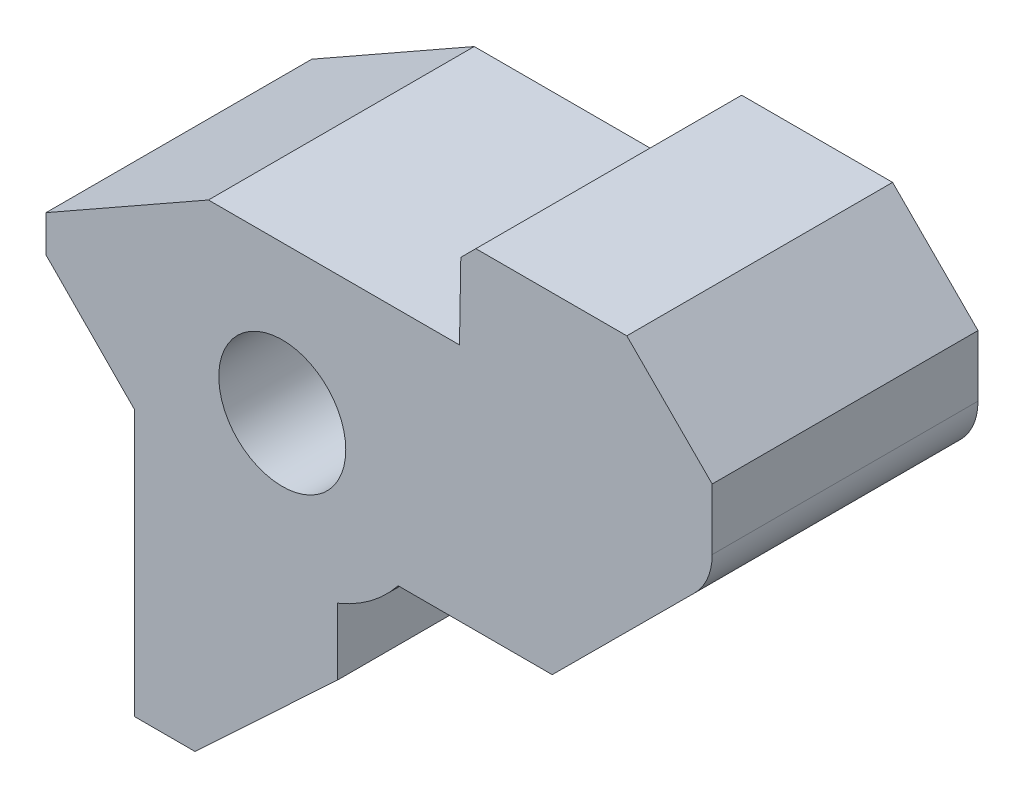
ISO-10303-21;
HEADER;
FILE_DESCRIPTION(('STEP AP214'),'2;1');
FILE_NAME('part.step','',(''),(''),'','','');
FILE_SCHEMA(('AUTOMOTIVE_DESIGN { 1 0 10303 214 1 1 1 1 }'));
ENDSEC;
DATA;
#1=APPLICATION_CONTEXT('core data for automotive mechanical design processes');
#2=APPLICATION_PROTOCOL_DEFINITION('international standard','automotive_design',2000,#1);
#3=PRODUCT_CONTEXT('',#1,'mechanical');
#4=PRODUCT('Part','Part','',(#3));
#5=PRODUCT_RELATED_PRODUCT_CATEGORY('part','',(#4));
#6=PRODUCT_DEFINITION_FORMATION('','',#4);
#7=PRODUCT_DEFINITION_CONTEXT('part definition',#1,'design');
#8=PRODUCT_DEFINITION('design','',#6,#7);
#9=PRODUCT_DEFINITION_SHAPE('','',#8);
#10=(LENGTH_UNIT() NAMED_UNIT(*) SI_UNIT(.MILLI.,.METRE.));
#11=(NAMED_UNIT(*) PLANE_ANGLE_UNIT() SI_UNIT($,.RADIAN.));
#12=(NAMED_UNIT(*) SI_UNIT($,.STERADIAN.) SOLID_ANGLE_UNIT());
#13=UNCERTAINTY_MEASURE_WITH_UNIT(LENGTH_MEASURE(1.E-05),#10,'distance_accuracy_value','');
#14=(GEOMETRIC_REPRESENTATION_CONTEXT(3) GLOBAL_UNCERTAINTY_ASSIGNED_CONTEXT((#13)) GLOBAL_UNIT_ASSIGNED_CONTEXT((#10,
#11,#12)) REPRESENTATION_CONTEXT('',''));
#15=CARTESIAN_POINT('',(0.,0.,0.));
#16=DIRECTION('',(0.,0.,1.));
#17=DIRECTION('',(1.,0.,0.));
#18=AXIS2_PLACEMENT_3D('',#15,#16,#17);
#19=CARTESIAN_POINT('',(0.,5.,4.5));
#20=DIRECTION('',(0.,-1.,0.));
#21=DIRECTION('',(1.,0.,0.));
#22=AXIS2_PLACEMENT_3D('',#19,#20,#21);
#23=PLANE('',#22);
#24=DIRECTION('',(-1.,0.,0.));
#25=VECTOR('',#24,1.);
#26=CARTESIAN_POINT('',(0.,5.,-4.5));
#27=LINE('',#26,#25);
#28=CARTESIAN_POINT('',(6.,5.,-4.5));
#29=VERTEX_POINT('',#28);
#30=CARTESIAN_POINT('',(-2.5,5.,-4.5));
#31=VERTEX_POINT('',#30);
#32=EDGE_CURVE('E169',#29,#31,#27,.T.);
#33=ORIENTED_EDGE('',*,*,#32,.T.);
#34=DIRECTION('',(0.,0.,-1.));
#35=VECTOR('',#34,1.);
#36=CARTESIAN_POINT('',(-2.5,5.,4.5));
#37=LINE('',#36,#35);
#38=CARTESIAN_POINT('',(-2.5,5.,4.5));
#39=VERTEX_POINT('',#38);
#40=EDGE_CURVE('E167',#39,#31,#37,.T.);
#41=ORIENTED_EDGE('',*,*,#40,.F.);
#42=DIRECTION('',(-1.,0.,0.));
#43=VECTOR('',#42,1.);
#44=CARTESIAN_POINT('',(0.,5.,4.5));
#45=LINE('',#44,#43);
#46=CARTESIAN_POINT('',(6.,5.,4.5));
#47=VERTEX_POINT('',#46);
#48=EDGE_CURVE('E153',#47,#39,#45,.T.);
#49=ORIENTED_EDGE('',*,*,#48,.F.);
#50=DIRECTION('',(0.,0.,-1.));
#51=VECTOR('',#50,1.);
#52=CARTESIAN_POINT('',(6.,5.,4.5));
#53=LINE('',#52,#51);
#54=EDGE_CURVE('E214',#47,#29,#53,.T.);
#55=ORIENTED_EDGE('',*,*,#54,.T.);
#56=EDGE_LOOP('',(#33,#41,#49,#55));
#57=FACE_BOUND('',#56,.T.);
#58=ADVANCED_FACE('F35',(#57),#23,.F.);
#59=CARTESIAN_POINT('',(-2.75518541810542,4.85518934634199,4.5));
#60=DIRECTION('',(-0.49354284315925,0.869721485284964,0.));
#61=DIRECTION('',(-0.869721485284964,-0.49354284315925,0.));
#62=AXIS2_PLACEMENT_3D('',#59,#60,#61);
#63=PLANE('',#62);
#64=DIRECTION('',(0.869721485284964,0.49354284315925,0.));
#65=VECTOR('',#64,1.);
#66=CARTESIAN_POINT('',(-2.75518541810542,4.85518934634199,-4.5));
#67=LINE('',#66,#65);
#68=CARTESIAN_POINT('',(-8.,1.87890240346716,-4.5));
#69=VERTEX_POINT('',#68);
#70=EDGE_CURVE('E216',#69,#31,#67,.T.);
#71=ORIENTED_EDGE('',*,*,#70,.F.);
#72=DIRECTION('',(0.,0.,-1.));
#73=VECTOR('',#72,1.);
#74=CARTESIAN_POINT('',(-8.,1.87890240346716,4.5));
#75=LINE('',#74,#73);
#76=CARTESIAN_POINT('',(-8.,1.87890240346716,4.5));
#77=VERTEX_POINT('',#76);
#78=EDGE_CURVE('E174',#77,#69,#75,.T.);
#79=ORIENTED_EDGE('',*,*,#78,.F.);
#80=DIRECTION('',(0.869721485284964,0.49354284315925,0.));
#81=VECTOR('',#80,1.);
#82=CARTESIAN_POINT('',(-2.75518541810542,4.85518934634199,4.5));
#83=LINE('',#82,#81);
#84=EDGE_CURVE('E159',#77,#39,#83,.T.);
#85=ORIENTED_EDGE('',*,*,#84,.T.);
#86=ORIENTED_EDGE('',*,*,#40,.T.);
#87=EDGE_LOOP('',(#71,#79,#85,#86));
#88=FACE_BOUND('',#87,.T.);
#89=ADVANCED_FACE('F176',(#88),#63,.T.);
#90=CARTESIAN_POINT('',(-8.,0.,4.5));
#91=DIRECTION('',(-1.,0.,0.));
#92=DIRECTION('',(0.,0.,1.));
#93=AXIS2_PLACEMENT_3D('',#90,#91,#92);
#94=PLANE('',#93);
#95=DIRECTION('',(0.,1.,0.));
#96=VECTOR('',#95,1.);
#97=CARTESIAN_POINT('',(-8.,0.,-4.5));
#98=LINE('',#97,#96);
#99=CARTESIAN_POINT('',(-8.,0.63825131466549,-4.5));
#100=VERTEX_POINT('',#99);
#101=EDGE_CURVE('E218',#100,#69,#98,.T.);
#102=ORIENTED_EDGE('',*,*,#101,.F.);
#103=DIRECTION('',(0.,0.,-1.));
#104=VECTOR('',#103,1.);
#105=CARTESIAN_POINT('',(-8.,0.63825131466549,4.5));
#106=LINE('',#105,#104);
#107=CARTESIAN_POINT('',(-8.,0.63825131466549,4.5));
#108=VERTEX_POINT('',#107);
#109=EDGE_CURVE('E277',#108,#100,#106,.T.);
#110=ORIENTED_EDGE('',*,*,#109,.F.);
#111=DIRECTION('',(0.,1.,0.));
#112=VECTOR('',#111,1.);
#113=CARTESIAN_POINT('',(-8.,0.,4.5));
#114=LINE('',#113,#112);
#115=EDGE_CURVE('E177',#108,#77,#114,.T.);
#116=ORIENTED_EDGE('',*,*,#115,.T.);
#117=ORIENTED_EDGE('',*,*,#78,.T.);
#118=EDGE_LOOP('',(#102,#110,#116,#117));
#119=FACE_BOUND('',#118,.T.);
#120=ADVANCED_FACE('F302',(#119),#94,.T.);
#121=CARTESIAN_POINT('',(-3.73157658636863,-3.684596368006,4.5));
#122=DIRECTION('',(-0.711571907086081,-0.702613279867295,0.));
#123=DIRECTION('',(0.702613279867295,-0.711571907086081,0.));
#124=AXIS2_PLACEMENT_3D('',#121,#122,#123);
#125=PLANE('',#124);
#126=DIRECTION('',(-0.702613279867295,0.711571907086081,0.));
#127=VECTOR('',#126,1.);
#128=CARTESIAN_POINT('',(-3.73157658636863,-3.684596368006,-4.5));
#129=LINE('',#128,#127);
#130=CARTESIAN_POINT('',(-5.,-2.4,-4.5));
#131=VERTEX_POINT('',#130);
#132=EDGE_CURVE('E221',#131,#100,#129,.T.);
#133=ORIENTED_EDGE('',*,*,#132,.F.);
#134=DIRECTION('',(0.,0.,-1.));
#135=VECTOR('',#134,1.);
#136=CARTESIAN_POINT('',(-5.,-2.4,4.5));
#137=LINE('',#136,#135);
#138=CARTESIAN_POINT('',(-5.,-2.4,4.5));
#139=VERTEX_POINT('',#138);
#140=EDGE_CURVE('E275',#139,#131,#137,.T.);
#141=ORIENTED_EDGE('',*,*,#140,.F.);
#142=DIRECTION('',(-0.702613279867295,0.711571907086081,0.));
#143=VECTOR('',#142,1.);
#144=CARTESIAN_POINT('',(-3.73157658636863,-3.684596368006,4.5));
#145=LINE('',#144,#143);
#146=EDGE_CURVE('E179',#139,#108,#145,.T.);
#147=ORIENTED_EDGE('',*,*,#146,.T.);
#148=ORIENTED_EDGE('',*,*,#109,.T.);
#149=EDGE_LOOP('',(#133,#141,#147,#148));
#150=FACE_BOUND('',#149,.T.);
#151=ADVANCED_FACE('F306',(#150),#125,.T.);
#152=CARTESIAN_POINT('',(-5.,0.,4.5));
#153=DIRECTION('',(-1.,0.,0.));
#154=DIRECTION('',(0.,-1.,0.));
#155=AXIS2_PLACEMENT_3D('',#152,#153,#154);
#156=PLANE('',#155);
#157=DIRECTION('',(0.,1.,0.));
#158=VECTOR('',#157,1.);
#159=CARTESIAN_POINT('',(-5.,0.,-4.5));
#160=LINE('',#159,#158);
#161=CARTESIAN_POINT('',(-5.,-11.4,-4.5));
#162=VERTEX_POINT('',#161);
#163=EDGE_CURVE('E224',#162,#131,#160,.T.);
#164=ORIENTED_EDGE('',*,*,#163,.F.);
#165=DIRECTION('',(0.,0.,-1.));
#166=VECTOR('',#165,1.);
#167=CARTESIAN_POINT('',(-5.,-11.4,4.5));
#168=LINE('',#167,#166);
#169=CARTESIAN_POINT('',(-5.,-11.4,4.5));
#170=VERTEX_POINT('',#169);
#171=EDGE_CURVE('E273',#170,#162,#168,.T.);
#172=ORIENTED_EDGE('',*,*,#171,.F.);
#173=DIRECTION('',(0.,1.,0.));
#174=VECTOR('',#173,1.);
#175=CARTESIAN_POINT('',(-5.,0.,4.5));
#176=LINE('',#175,#174);
#177=EDGE_CURVE('E184',#170,#139,#176,.T.);
#178=ORIENTED_EDGE('',*,*,#177,.T.);
#179=ORIENTED_EDGE('',*,*,#140,.T.);
#180=EDGE_LOOP('',(#164,#172,#178,#179));
#181=FACE_BOUND('',#180,.T.);
#182=ADVANCED_FACE('F309',(#181),#156,.T.);
#183=CARTESIAN_POINT('',(0.,-11.4,4.5));
#184=DIRECTION('',(0.,-1.,0.));
#185=DIRECTION('',(0.,0.,-1.));
#186=AXIS2_PLACEMENT_3D('',#183,#184,#185);
#187=PLANE('',#186);
#188=DIRECTION('',(-1.,0.,0.));
#189=VECTOR('',#188,1.);
#190=CARTESIAN_POINT('',(0.,-11.4,-4.5));
#191=LINE('',#190,#189);
#192=CARTESIAN_POINT('',(-2.95681906505285,-11.4,-4.5));
#193=VERTEX_POINT('',#192);
#194=EDGE_CURVE('E227',#193,#162,#191,.T.);
#195=ORIENTED_EDGE('',*,*,#194,.F.);
#196=DIRECTION('',(0.,0.,-1.));
#197=VECTOR('',#196,1.);
#198=CARTESIAN_POINT('',(-2.95681906505285,-11.4,4.5));
#199=LINE('',#198,#197);
#200=CARTESIAN_POINT('',(-2.95681906505285,-11.4,4.5));
#201=VERTEX_POINT('',#200);
#202=EDGE_CURVE('E271',#201,#193,#199,.T.);
#203=ORIENTED_EDGE('',*,*,#202,.F.);
#204=DIRECTION('',(-1.,0.,0.));
#205=VECTOR('',#204,1.);
#206=CARTESIAN_POINT('',(0.,-11.4,4.5));
#207=LINE('',#206,#205);
#208=EDGE_CURVE('E187',#201,#170,#207,.T.);
#209=ORIENTED_EDGE('',*,*,#208,.T.);
#210=ORIENTED_EDGE('',*,*,#171,.T.);
#211=EDGE_LOOP('',(#195,#203,#209,#210));
#212=FACE_BOUND('',#211,.T.);
#213=ADVANCED_FACE('F313',(#212),#187,.T.);
#214=CARTESIAN_POINT('',(4.30946243756391,-4.61545732969715,4.5));
#215=DIRECTION('',(-0.682462310143159,0.730920785881796,0.));
#216=DIRECTION('',(-0.730920785881796,-0.682462310143159,0.));
#217=AXIS2_PLACEMENT_3D('',#214,#215,#216);
#218=PLANE('',#217);
#219=DIRECTION('',(0.730920785881796,0.682462310143159,0.));
#220=VECTOR('',#219,1.);
#221=CARTESIAN_POINT('',(4.30946243756391,-4.61545732969715,-4.5));
#222=LINE('',#221,#220);
#223=CARTESIAN_POINT('',(1.87605445969652,-6.88753559340758,-4.5));
#224=VERTEX_POINT('',#223);
#225=EDGE_CURVE('E230',#193,#224,#222,.T.);
#226=ORIENTED_EDGE('',*,*,#225,.T.);
#227=DIRECTION('',(0.,0.,-1.));
#228=VECTOR('',#227,1.);
#229=CARTESIAN_POINT('',(1.87605445969652,-6.88753559340758,4.5));
#230=LINE('',#229,#228);
#231=CARTESIAN_POINT('',(1.87605445969652,-6.88753559340758,4.5));
#232=VERTEX_POINT('',#231);
#233=EDGE_CURVE('E269',#232,#224,#230,.T.);
#234=ORIENTED_EDGE('',*,*,#233,.F.);
#235=DIRECTION('',(0.730920785881796,0.682462310143159,0.));
#236=VECTOR('',#235,1.);
#237=CARTESIAN_POINT('',(4.30946243756391,-4.61545732969715,4.5));
#238=LINE('',#237,#236);
#239=EDGE_CURVE('E190',#201,#232,#238,.T.);
#240=ORIENTED_EDGE('',*,*,#239,.F.);
#241=ORIENTED_EDGE('',*,*,#202,.T.);
#242=EDGE_LOOP('',(#226,#234,#240,#241));
#243=FACE_BOUND('',#242,.T.);
#244=ADVANCED_FACE('F318',(#243),#218,.F.);
#245=CARTESIAN_POINT('',(1.87605445969652,0.,4.5));
#246=DIRECTION('',(1.,0.,0.));
#247=DIRECTION('',(0.,1.,0.));
#248=AXIS2_PLACEMENT_3D('',#245,#246,#247);
#249=PLANE('',#248);
#250=DIRECTION('',(0.,-1.,0.));
#251=VECTOR('',#250,1.);
#252=CARTESIAN_POINT('',(1.87605445969652,0.,-4.5));
#253=LINE('',#252,#251);
#254=CARTESIAN_POINT('',(1.87605445969652,-4.63469736490451,-4.5));
#255=VERTEX_POINT('',#254);
#256=EDGE_CURVE('E233',#255,#224,#253,.T.);
#257=ORIENTED_EDGE('',*,*,#256,.F.);
#258=DIRECTION('',(0.,0.,-1.));
#259=VECTOR('',#258,1.);
#260=CARTESIAN_POINT('',(1.87605445969652,-4.63469736490451,4.5));
#261=LINE('',#260,#259);
#262=CARTESIAN_POINT('',(1.87605445969652,-4.63469736490451,4.5));
#263=VERTEX_POINT('',#262);
#264=EDGE_CURVE('E267',#263,#255,#261,.T.);
#265=ORIENTED_EDGE('',*,*,#264,.F.);
#266=DIRECTION('',(0.,-1.,0.));
#267=VECTOR('',#266,1.);
#268=CARTESIAN_POINT('',(1.87605445969652,0.,4.5));
#269=LINE('',#268,#267);
#270=EDGE_CURVE('E192',#263,#232,#269,.T.);
#271=ORIENTED_EDGE('',*,*,#270,.T.);
#272=ORIENTED_EDGE('',*,*,#233,.T.);
#273=EDGE_LOOP('',(#257,#265,#271,#272));
#274=FACE_BOUND('',#273,.T.);
#275=ADVANCED_FACE('F325',(#274),#249,.T.);
#276=CARTESIAN_POINT('',(0.,0.,4.5));
#277=DIRECTION('',(0.,0.,-1.));
#278=DIRECTION('',(-1.,0.,0.));
#279=AXIS2_PLACEMENT_3D('',#276,#277,#278);
#280=CYLINDRICAL_SURFACE('',#279,5.);
#281=CARTESIAN_POINT('',(0.,0.,-4.5));
#282=DIRECTION('',(0.,0.,1.));
#283=DIRECTION('',(1.,0.,0.));
#284=AXIS2_PLACEMENT_3D('',#281,#282,#283);
#285=CIRCLE('',#284,5.);
#286=CARTESIAN_POINT('',(3.92300904918661,-3.1,-4.5));
#287=VERTEX_POINT('',#286);
#288=EDGE_CURVE('E236',#255,#287,#285,.T.);
#289=ORIENTED_EDGE('',*,*,#288,.T.);
#290=DIRECTION('',(0.,0.,-1.));
#291=VECTOR('',#290,1.);
#292=CARTESIAN_POINT('',(3.92300904918661,-3.1,4.5));
#293=LINE('',#292,#291);
#294=CARTESIAN_POINT('',(3.92300904918661,-3.1,4.5));
#295=VERTEX_POINT('',#294);
#296=EDGE_CURVE('E265',#295,#287,#293,.T.);
#297=ORIENTED_EDGE('',*,*,#296,.F.);
#298=CARTESIAN_POINT('',(0.,0.,4.5));
#299=DIRECTION('',(0.,0.,1.));
#300=DIRECTION('',(1.,0.,0.));
#301=AXIS2_PLACEMENT_3D('',#298,#299,#300);
#302=CIRCLE('',#301,5.);
#303=EDGE_CURVE('E195',#263,#295,#302,.T.);
#304=ORIENTED_EDGE('',*,*,#303,.F.);
#305=ORIENTED_EDGE('',*,*,#264,.T.);
#306=EDGE_LOOP('',(#289,#297,#304,#305));
#307=FACE_BOUND('',#306,.T.);
#308=ADVANCED_FACE('F328',(#307),#280,.T.);
#309=CARTESIAN_POINT('',(0.,-3.1,4.5));
#310=DIRECTION('',(0.,-1.,0.));
#311=DIRECTION('',(1.,0.,0.));
#312=AXIS2_PLACEMENT_3D('',#309,#310,#311);
#313=PLANE('',#312);
#314=DIRECTION('',(-1.,0.,0.));
#315=VECTOR('',#314,1.);
#316=CARTESIAN_POINT('',(0.,-3.1,-4.5));
#317=LINE('',#316,#315);
#318=CARTESIAN_POINT('',(9.1401017394302,-3.1,-4.5));
#319=VERTEX_POINT('',#318);
#320=EDGE_CURVE('E239',#319,#287,#317,.T.);
#321=ORIENTED_EDGE('',*,*,#320,.F.);
#322=DIRECTION('',(0.,0.,-1.));
#323=VECTOR('',#322,1.);
#324=CARTESIAN_POINT('',(9.1401017394302,-3.1,4.5));
#325=LINE('',#324,#323);
#326=CARTESIAN_POINT('',(9.1401017394302,-3.1,4.5));
#327=VERTEX_POINT('',#326);
#328=EDGE_CURVE('E262',#327,#319,#325,.T.);
#329=ORIENTED_EDGE('',*,*,#328,.F.);
#330=DIRECTION('',(-1.,0.,0.));
#331=VECTOR('',#330,1.);
#332=CARTESIAN_POINT('',(0.,-3.1,4.5));
#333=LINE('',#332,#331);
#334=EDGE_CURVE('E197',#327,#295,#333,.T.);
#335=ORIENTED_EDGE('',*,*,#334,.T.);
#336=ORIENTED_EDGE('',*,*,#296,.T.);
#337=EDGE_LOOP('',(#321,#329,#335,#336));
#338=FACE_BOUND('',#337,.T.);
#339=ADVANCED_FACE('F332',(#338),#313,.T.);
#340=CARTESIAN_POINT('',(6.10570188487334,-6.12489244807211,4.5));
#341=DIRECTION('',(0.70599641760228,-0.708215403908124,0.));
#342=DIRECTION('',(0.708215403908124,0.70599641760228,0.));
#343=AXIS2_PLACEMENT_3D('',#340,#341,#342);
#344=PLANE('',#343);
#345=DIRECTION('',(-0.708215403908124,-0.70599641760228,0.));
#346=VECTOR('',#345,1.);
#347=CARTESIAN_POINT('',(6.10570188487334,-6.12489244807211,-4.5));
#348=LINE('',#347,#346);
#349=CARTESIAN_POINT('',(13.9690670772606,1.71383518407077,-4.5));
#350=VERTEX_POINT('',#349);
#351=EDGE_CURVE('E242',#350,#319,#348,.T.);
#352=ORIENTED_EDGE('',*,*,#351,.F.);
#353=DIRECTION('',(0.,0.,-1.));
#354=VECTOR('',#353,1.);
#355=CARTESIAN_POINT('',(13.9690670772606,1.71383518407077,4.5));
#356=LINE('',#355,#354);
#357=CARTESIAN_POINT('',(13.9690670772606,1.71383518407077,4.5));
#358=VERTEX_POINT('',#357);
#359=EDGE_CURVE('E284',#350,#358,#356,.F.);
#360=ORIENTED_EDGE('',*,*,#359,.T.);
#361=DIRECTION('',(-0.708215403908124,-0.70599641760228,0.));
#362=VECTOR('',#361,1.);
#363=CARTESIAN_POINT('',(6.10570188487334,-6.12489244807211,4.5));
#364=LINE('',#363,#362);
#365=EDGE_CURVE('E200',#358,#327,#364,.T.);
#366=ORIENTED_EDGE('',*,*,#365,.T.);
#367=ORIENTED_EDGE('',*,*,#328,.T.);
#368=EDGE_LOOP('',(#352,#360,#366,#367));
#369=FACE_BOUND('',#368,.T.);
#370=ADVANCED_FACE('F377',(#369),#344,.T.);
#371=CARTESIAN_POINT('',(14.557074242056,0.,4.5));
#372=DIRECTION('',(1.,0.,0.));
#373=DIRECTION('',(0.,0.,-1.));
#374=AXIS2_PLACEMENT_3D('',#371,#372,#373);
#375=PLANE('',#374);
#376=DIRECTION('',(0.,-1.,0.));
#377=VECTOR('',#376,1.);
#378=CARTESIAN_POINT('',(14.557074242056,0.,4.5));
#379=LINE('',#378,#377);
#380=CARTESIAN_POINT('',(14.557074242056,5.2,4.5));
#381=VERTEX_POINT('',#380);
#382=CARTESIAN_POINT('',(14.557074242056,3.13026599188701,4.5));
#383=VERTEX_POINT('',#382);
#384=EDGE_CURVE('E202',#381,#383,#379,.T.);
#385=ORIENTED_EDGE('',*,*,#384,.T.);
#386=DIRECTION('',(0.,0.,-1.));
#387=VECTOR('',#386,1.);
#388=CARTESIAN_POINT('',(14.557074242056,3.13026599188701,4.5));
#389=LINE('',#388,#387);
#390=CARTESIAN_POINT('',(14.557074242056,3.13026599188701,-4.5));
#391=VERTEX_POINT('',#390);
#392=EDGE_CURVE('E173',#383,#391,#389,.T.);
#393=ORIENTED_EDGE('',*,*,#392,.T.);
#394=DIRECTION('',(0.,-1.,0.));
#395=VECTOR('',#394,1.);
#396=CARTESIAN_POINT('',(14.557074242056,0.,-4.5));
#397=LINE('',#396,#395);
#398=CARTESIAN_POINT('',(14.557074242056,5.2,-4.5));
#399=VERTEX_POINT('',#398);
#400=EDGE_CURVE('E244',#399,#391,#397,.T.);
#401=ORIENTED_EDGE('',*,*,#400,.F.);
#402=DIRECTION('',(0.,0.,-1.));
#403=VECTOR('',#402,1.);
#404=CARTESIAN_POINT('',(14.557074242056,5.2,4.5));
#405=LINE('',#404,#403);
#406=EDGE_CURVE('E260',#381,#399,#405,.T.);
#407=ORIENTED_EDGE('',*,*,#406,.F.);
#408=EDGE_LOOP('',(#385,#393,#401,#407));
#409=FACE_BOUND('',#408,.T.);
#410=ADVANCED_FACE('F343',(#409),#375,.T.);
#411=CARTESIAN_POINT('',(9.90136521752732,9.87034217890714,4.5));
#412=DIRECTION('',(0.708215403908124,0.70599641760228,0.));
#413=DIRECTION('',(-0.70599641760228,0.708215403908124,0.));
#414=AXIS2_PLACEMENT_3D('',#411,#412,#413);
#415=PLANE('',#414);
#416=DIRECTION('',(0.70599641760228,-0.708215403908124,0.));
#417=VECTOR('',#416,1.);
#418=CARTESIAN_POINT('',(9.90136521752732,9.87034217890714,-4.5));
#419=LINE('',#418,#417);
#420=CARTESIAN_POINT('',(11.6661605458153,8.1,-4.5));
#421=VERTEX_POINT('',#420);
#422=EDGE_CURVE('E247',#421,#399,#419,.T.);
#423=ORIENTED_EDGE('',*,*,#422,.F.);
#424=DIRECTION('',(0.,0.,-1.));
#425=VECTOR('',#424,1.);
#426=CARTESIAN_POINT('',(11.6661605458153,8.1,4.5));
#427=LINE('',#426,#425);
#428=CARTESIAN_POINT('',(11.6661605458153,8.1,4.5));
#429=VERTEX_POINT('',#428);
#430=EDGE_CURVE('E257',#429,#421,#427,.T.);
#431=ORIENTED_EDGE('',*,*,#430,.F.);
#432=DIRECTION('',(0.70599641760228,-0.708215403908124,0.));
#433=VECTOR('',#432,1.);
#434=CARTESIAN_POINT('',(9.90136521752732,9.87034217890714,4.5));
#435=LINE('',#434,#433);
#436=EDGE_CURVE('E205',#429,#381,#435,.T.);
#437=ORIENTED_EDGE('',*,*,#436,.T.);
#438=ORIENTED_EDGE('',*,*,#406,.T.);
#439=EDGE_LOOP('',(#423,#431,#437,#438));
#440=FACE_BOUND('',#439,.T.);
#441=ADVANCED_FACE('F348',(#440),#415,.T.);
#442=CARTESIAN_POINT('',(0.,8.1,4.5));
#443=DIRECTION('',(0.,1.,0.));
#444=DIRECTION('',(0.,0.,1.));
#445=AXIS2_PLACEMENT_3D('',#442,#443,#444);
#446=PLANE('',#445);
#447=DIRECTION('',(1.,0.,0.));
#448=VECTOR('',#447,1.);
#449=CARTESIAN_POINT('',(0.,8.1,-4.5));
#450=LINE('',#449,#448);
#451=CARTESIAN_POINT('',(6.55411070127746,8.1,-4.5));
#452=VERTEX_POINT('',#451);
#453=EDGE_CURVE('E250',#452,#421,#450,.T.);
#454=ORIENTED_EDGE('',*,*,#453,.F.);
#455=DIRECTION('',(0.,0.,1.));
#456=VECTOR('',#455,1.);
#457=CARTESIAN_POINT('',(6.55411070127746,8.1,4.5));
#458=LINE('',#457,#456);
#459=CARTESIAN_POINT('',(6.55411070127747,8.1,4.5));
#460=VERTEX_POINT('',#459);
#461=EDGE_CURVE('E43',#452,#460,#458,.T.);
#462=ORIENTED_EDGE('',*,*,#461,.T.);
#463=DIRECTION('',(1.,0.,0.));
#464=VECTOR('',#463,1.);
#465=CARTESIAN_POINT('',(0.,8.1,4.5));
#466=LINE('',#465,#464);
#467=EDGE_CURVE('E208',#460,#429,#466,.T.);
#468=ORIENTED_EDGE('',*,*,#467,.T.);
#469=ORIENTED_EDGE('',*,*,#430,.T.);
#470=EDGE_LOOP('',(#454,#462,#468,#469));
#471=FACE_BOUND('',#470,.T.);
#472=ADVANCED_FACE('F384',(#471),#446,.T.);
#473=CARTESIAN_POINT('',(5.91092373930106,-0.103175557655219,4.5));
#474=DIRECTION('',(-0.999847695156391,0.0174524064372794,0.));
#475=DIRECTION('',(-0.0174524064372794,-0.999847695156391,0.));
#476=AXIS2_PLACEMENT_3D('',#473,#474,#475);
#477=PLANE('',#476);
#478=DIRECTION('',(0.0174524064372794,0.999847695156391,0.));
#479=VECTOR('',#478,1.);
#480=CARTESIAN_POINT('',(5.91092373930106,-0.103175557655219,4.5));
#481=LINE('',#480,#479);
#482=CARTESIAN_POINT('',(6.04522812282982,7.59111742155236,4.5));
#483=VERTEX_POINT('',#482);
#484=EDGE_CURVE('E162',#47,#483,#481,.T.);
#485=ORIENTED_EDGE('',*,*,#484,.T.);
#486=DIRECTION('',(0.,0.,-1.));
#487=VECTOR('',#486,1.);
#488=CARTESIAN_POINT('',(6.04522812282982,7.59111742155236,4.5));
#489=LINE('',#488,#487);
#490=CARTESIAN_POINT('',(6.04522812282982,7.59111742155236,-4.5));
#491=VERTEX_POINT('',#490);
#492=EDGE_CURVE('E288',#483,#491,#489,.T.);
#493=ORIENTED_EDGE('',*,*,#492,.T.);
#494=DIRECTION('',(0.0174524064372794,0.999847695156391,0.));
#495=VECTOR('',#494,1.);
#496=CARTESIAN_POINT('',(5.91092373930106,-0.103175557655219,-4.5));
#497=LINE('',#496,#495);
#498=EDGE_CURVE('E252',#29,#491,#497,.T.);
#499=ORIENTED_EDGE('',*,*,#498,.F.);
#500=ORIENTED_EDGE('',*,*,#54,.F.);
#501=EDGE_LOOP('',(#485,#493,#499,#500));
#502=FACE_BOUND('',#501,.T.);
#503=ADVANCED_FACE('F294',(#502),#477,.T.);
#504=CARTESIAN_POINT('',(0.,0.,4.5));
#505=DIRECTION('',(0.,0.,-1.));
#506=DIRECTION('',(-1.,0.,0.));
#507=AXIS2_PLACEMENT_3D('',#504,#505,#506);
#508=CYLINDRICAL_SURFACE('',#507,2.15);
#509=CARTESIAN_POINT('',(0.,0.,4.5));
#510=DIRECTION('',(0.,0.,1.));
#511=DIRECTION('',(1.,0.,0.));
#512=AXIS2_PLACEMENT_3D('',#509,#510,#511);
#513=CIRCLE('',#512,2.15);
#514=CARTESIAN_POINT('',(2.15,0.,4.5));
#515=VERTEX_POINT('',#514);
#516=EDGE_CURVE('E211',#515,#515,#513,.T.);
#517=ORIENTED_EDGE('',*,*,#516,.T.);
#518=EDGE_LOOP('',(#517));
#519=FACE_BOUND('',#518,.T.);
#520=CARTESIAN_POINT('',(0.,0.,-4.5));
#521=DIRECTION('',(0.,0.,1.));
#522=DIRECTION('',(1.,0.,0.));
#523=AXIS2_PLACEMENT_3D('',#520,#521,#522);
#524=CIRCLE('',#523,2.15);
#525=CARTESIAN_POINT('',(2.15,0.,-4.5));
#526=VERTEX_POINT('',#525);
#527=EDGE_CURVE('E164',#526,#526,#524,.T.);
#528=ORIENTED_EDGE('',*,*,#527,.F.);
#529=EDGE_LOOP('',(#528));
#530=FACE_BOUND('',#529,.T.);
#531=ADVANCED_FACE('F389',(#519,#530),#508,.F.);
#532=CARTESIAN_POINT('',(0.,0.,4.5));
#533=DIRECTION('',(0.,0.,1.));
#534=DIRECTION('',(1.,0.,0.));
#535=AXIS2_PLACEMENT_3D('',#532,#533,#534);
#536=PLANE('',#535);
#537=ORIENTED_EDGE('',*,*,#467,.F.);
#538=DIRECTION('',(0.70710678118655,0.707106781186545,0.));
#539=VECTOR('',#538,1.);
#540=CARTESIAN_POINT('',(-0.772944649361291,0.772944649361296,4.5));
#541=LINE('',#540,#539);
#542=EDGE_CURVE('E11',#460,#483,#541,.F.);
#543=ORIENTED_EDGE('',*,*,#542,.T.);
#544=ORIENTED_EDGE('',*,*,#484,.F.);
#545=ORIENTED_EDGE('',*,*,#48,.T.);
#546=ORIENTED_EDGE('',*,*,#84,.F.);
#547=ORIENTED_EDGE('',*,*,#115,.F.);
#548=ORIENTED_EDGE('',*,*,#146,.F.);
#549=ORIENTED_EDGE('',*,*,#177,.F.);
#550=ORIENTED_EDGE('',*,*,#208,.F.);
#551=ORIENTED_EDGE('',*,*,#239,.T.);
#552=ORIENTED_EDGE('',*,*,#270,.F.);
#553=ORIENTED_EDGE('',*,*,#303,.T.);
#554=ORIENTED_EDGE('',*,*,#334,.F.);
#555=ORIENTED_EDGE('',*,*,#365,.F.);
#556=CARTESIAN_POINT('',(12.557074242056,3.13026599188701,4.5));
#557=DIRECTION('',(0.,0.,1.));
#558=DIRECTION('',(1.,0.,0.));
#559=AXIS2_PLACEMENT_3D('',#556,#557,#558);
#560=CIRCLE('',#559,2.);
#561=EDGE_CURVE('E286',#358,#383,#560,.T.);
#562=ORIENTED_EDGE('',*,*,#561,.T.);
#563=ORIENTED_EDGE('',*,*,#384,.F.);
#564=ORIENTED_EDGE('',*,*,#436,.F.);
#565=EDGE_LOOP('',(#537,#543,#544,#545,#546,#547,#548,#549,#550,#551,#552,#553,#554,#555,#562,
#563,#564));
#566=FACE_BOUND('',#565,.T.);
#567=ORIENTED_EDGE('',*,*,#516,.F.);
#568=EDGE_LOOP('',(#567));
#569=FACE_BOUND('',#568,.T.);
#570=ADVANCED_FACE('F155',(#566,#569),#536,.T.);
#571=CARTESIAN_POINT('',(0.,0.,-4.5));
#572=DIRECTION('',(0.,0.,1.));
#573=DIRECTION('',(1.,0.,0.));
#574=AXIS2_PLACEMENT_3D('',#571,#572,#573);
#575=PLANE('',#574);
#576=ORIENTED_EDGE('',*,*,#498,.T.);
#577=DIRECTION('',(-0.70710678118655,-0.707106781186545,0.));
#578=VECTOR('',#577,1.);
#579=CARTESIAN_POINT('',(6.04522812282982,7.59111742155236,-4.5));
#580=LINE('',#579,#578);
#581=EDGE_CURVE('E57',#491,#452,#580,.F.);
#582=ORIENTED_EDGE('',*,*,#581,.T.);
#583=ORIENTED_EDGE('',*,*,#453,.T.);
#584=ORIENTED_EDGE('',*,*,#422,.T.);
#585=ORIENTED_EDGE('',*,*,#400,.T.);
#586=CARTESIAN_POINT('',(12.557074242056,3.13026599188701,-4.5));
#587=DIRECTION('',(0.,0.,1.));
#588=DIRECTION('',(1.,0.,0.));
#589=AXIS2_PLACEMENT_3D('',#586,#587,#588);
#590=CIRCLE('',#589,2.);
#591=EDGE_CURVE('E282',#391,#350,#590,.F.);
#592=ORIENTED_EDGE('',*,*,#591,.T.);
#593=ORIENTED_EDGE('',*,*,#351,.T.);
#594=ORIENTED_EDGE('',*,*,#320,.T.);
#595=ORIENTED_EDGE('',*,*,#288,.F.);
#596=ORIENTED_EDGE('',*,*,#256,.T.);
#597=ORIENTED_EDGE('',*,*,#225,.F.);
#598=ORIENTED_EDGE('',*,*,#194,.T.);
#599=ORIENTED_EDGE('',*,*,#163,.T.);
#600=ORIENTED_EDGE('',*,*,#132,.T.);
#601=ORIENTED_EDGE('',*,*,#101,.T.);
#602=ORIENTED_EDGE('',*,*,#70,.T.);
#603=ORIENTED_EDGE('',*,*,#32,.F.);
#604=EDGE_LOOP('',(#576,#582,#583,#584,#585,#592,#593,#594,#595,#596,#597,#598,#599,#600,#601,
#602,#603));
#605=FACE_BOUND('',#604,.T.);
#606=ORIENTED_EDGE('',*,*,#527,.T.);
#607=EDGE_LOOP('',(#606));
#608=FACE_BOUND('',#607,.T.);
#609=ADVANCED_FACE('F297',(#605,#608),#575,.F.);
#610=CARTESIAN_POINT('',(12.557074242056,3.13026599188701,4.5));
#611=DIRECTION('',(0.,0.,-1.));
#612=DIRECTION('',(-1.,0.,0.));
#613=AXIS2_PLACEMENT_3D('',#610,#611,#612);
#614=CYLINDRICAL_SURFACE('',#613,2.);
#615=ORIENTED_EDGE('',*,*,#561,.F.);
#616=ORIENTED_EDGE('',*,*,#359,.F.);
#617=ORIENTED_EDGE('',*,*,#591,.F.);
#618=ORIENTED_EDGE('',*,*,#392,.F.);
#619=EDGE_LOOP('',(#615,#616,#617,#618));
#620=FACE_BOUND('',#619,.T.);
#621=ADVANCED_FACE('F340',(#620),#614,.T.);
#622=CARTESIAN_POINT('',(6.04522812282982,7.59111742155236,4.5));
#623=DIRECTION('',(0.707106781186545,-0.70710678118655,0.));
#624=DIRECTION('',(0.,0.,-1.));
#625=AXIS2_PLACEMENT_3D('',#622,#623,#624);
#626=PLANE('',#625);
#627=ORIENTED_EDGE('',*,*,#542,.F.);
#628=ORIENTED_EDGE('',*,*,#461,.F.);
#629=ORIENTED_EDGE('',*,*,#581,.F.);
#630=ORIENTED_EDGE('',*,*,#492,.F.);
#631=EDGE_LOOP('',(#627,#628,#629,#630));
#632=FACE_BOUND('',#631,.T.);
#633=ADVANCED_FACE('F37',(#632),#626,.F.);
#634=CLOSED_SHELL('',(#58,#89,#120,#151,#182,#213,#244,#275,#308,#339,#370,#410,#441,#472,#503,
#531,#570,#609,#621,#633));
#635=MANIFOLD_SOLID_BREP('B2',#634);
#636=ADVANCED_BREP_SHAPE_REPRESENTATION('',(#18,#635),#14);
#637=SHAPE_DEFINITION_REPRESENTATION(#9,#636);
ENDSEC;
END-ISO-10303-21;
